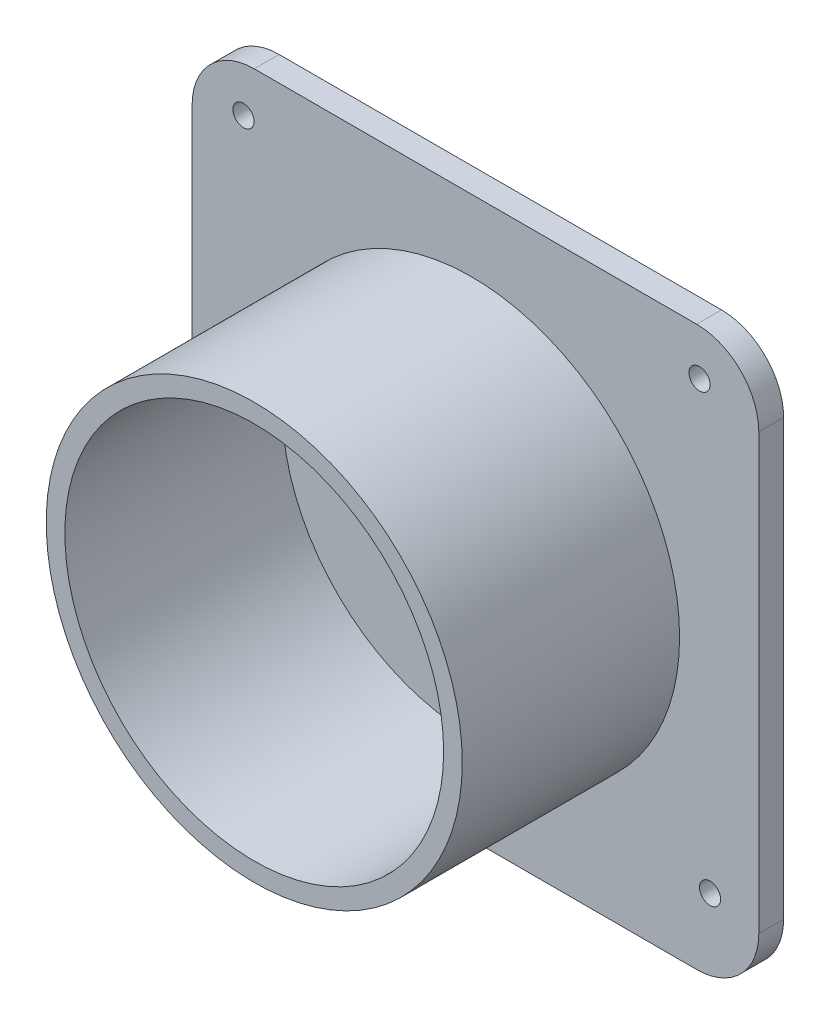
ISO-10303-21;
HEADER;
FILE_DESCRIPTION(('STEP AP214'),'2;1');
FILE_NAME('part.step','',(''),(''),'','','');
FILE_SCHEMA(('AUTOMOTIVE_DESIGN { 1 0 10303 214 1 1 1 1 }'));
ENDSEC;
DATA;
#1=APPLICATION_CONTEXT('core data for automotive mechanical design processes');
#2=APPLICATION_PROTOCOL_DEFINITION('international standard','automotive_design',2000,#1);
#3=PRODUCT_CONTEXT('',#1,'mechanical');
#4=PRODUCT('Part','Part','',(#3));
#5=PRODUCT_RELATED_PRODUCT_CATEGORY('part','',(#4));
#6=PRODUCT_DEFINITION_FORMATION('','',#4);
#7=PRODUCT_DEFINITION_CONTEXT('part definition',#1,'design');
#8=PRODUCT_DEFINITION('design','',#6,#7);
#9=PRODUCT_DEFINITION_SHAPE('','',#8);
#10=(LENGTH_UNIT() NAMED_UNIT(*) SI_UNIT(.MILLI.,.METRE.));
#11=(NAMED_UNIT(*) PLANE_ANGLE_UNIT() SI_UNIT($,.RADIAN.));
#12=(NAMED_UNIT(*) SI_UNIT($,.STERADIAN.) SOLID_ANGLE_UNIT());
#13=UNCERTAINTY_MEASURE_WITH_UNIT(LENGTH_MEASURE(1.E-05),#10,'distance_accuracy_value','');
#14=(GEOMETRIC_REPRESENTATION_CONTEXT(3) GLOBAL_UNCERTAINTY_ASSIGNED_CONTEXT((#13)) GLOBAL_UNIT_ASSIGNED_CONTEXT((#10,
#11,#12)) REPRESENTATION_CONTEXT('',''));
#15=CARTESIAN_POINT('',(0.,0.,0.));
#16=DIRECTION('',(0.,0.,1.));
#17=DIRECTION('',(1.,0.,0.));
#18=AXIS2_PLACEMENT_3D('',#15,#16,#17);
#19=CARTESIAN_POINT('',(-85.0491177864963,50.5839416058394,-5.));
#20=DIRECTION('',(-1.,0.,0.));
#21=DIRECTION('',(0.,-1.,0.));
#22=AXIS2_PLACEMENT_3D('',#19,#20,#21);
#23=PLANE('',#22);
#24=DIRECTION('',(0.,1.,0.));
#25=VECTOR('',#24,1.);
#26=CARTESIAN_POINT('',(-85.0491177864963,50.5839416058394,-4.00000000000001));
#27=LINE('',#26,#25);
#28=CARTESIAN_POINT('',(-85.0491177864963,-29.4160583941605,-4.00000000000001));
#29=VERTEX_POINT('',#28);
#30=CARTESIAN_POINT('',(-85.0491177864963,40.5839416058394,-4.00000000000001));
#31=VERTEX_POINT('',#30);
#32=EDGE_CURVE('E112',#29,#31,#27,.T.);
#33=ORIENTED_EDGE('',*,*,#32,.F.);
#34=DIRECTION('',(0.,0.,1.));
#35=VECTOR('',#34,1.);
#36=CARTESIAN_POINT('',(-85.0491177864963,-29.4160583941606,-5.));
#37=LINE('',#36,#35);
#38=CARTESIAN_POINT('',(-85.0491177864963,-29.4160583941605,0.));
#39=VERTEX_POINT('',#38);
#40=EDGE_CURVE('E125',#29,#39,#37,.T.);
#41=ORIENTED_EDGE('',*,*,#40,.T.);
#42=DIRECTION('',(0.,-1.,0.));
#43=VECTOR('',#42,1.);
#44=CARTESIAN_POINT('',(-85.0491177864963,50.5839416058394,0.));
#45=LINE('',#44,#43);
#46=CARTESIAN_POINT('',(-85.0491177864963,40.5839416058394,0.));
#47=VERTEX_POINT('',#46);
#48=EDGE_CURVE('E190',#47,#39,#45,.T.);
#49=ORIENTED_EDGE('',*,*,#48,.F.);
#50=DIRECTION('',(0.,0.,1.));
#51=VECTOR('',#50,1.);
#52=CARTESIAN_POINT('',(-85.0491177864963,40.5839416058394,-4.00000000000001));
#53=LINE('',#52,#51);
#54=EDGE_CURVE('E128',#47,#31,#53,.F.);
#55=ORIENTED_EDGE('',*,*,#54,.T.);
#56=EDGE_LOOP('',(#33,#41,#49,#55));
#57=FACE_BOUND('',#56,.T.);
#58=ADVANCED_FACE('F43',(#57),#23,.T.);
#59=CARTESIAN_POINT('',(-85.0491177864963,50.5839416058394,-5.));
#60=DIRECTION('',(0.,-1.,0.));
#61=DIRECTION('',(0.,0.,-1.));
#62=AXIS2_PLACEMENT_3D('',#59,#60,#61);
#63=PLANE('',#62);
#64=DIRECTION('',(1.,0.,0.));
#65=VECTOR('',#64,1.);
#66=CARTESIAN_POINT('',(-85.0491177864963,50.5839416058394,0.));
#67=LINE('',#66,#65);
#68=CARTESIAN_POINT('',(-75.0491177864963,50.5839416058394,0.));
#69=VERTEX_POINT('',#68);
#70=CARTESIAN_POINT('',(-3.79544039840603,50.5839416058394,0.));
#71=VERTEX_POINT('',#70);
#72=EDGE_CURVE('E176',#69,#71,#67,.T.);
#73=ORIENTED_EDGE('',*,*,#72,.T.);
#74=DIRECTION('',(0.,0.,1.));
#75=VECTOR('',#74,1.);
#76=CARTESIAN_POINT('',(-3.79544039840603,50.5839416058394,-5.));
#77=LINE('',#76,#75);
#78=CARTESIAN_POINT('',(-3.79544039840603,50.5839416058394,-4.00000000000001));
#79=VERTEX_POINT('',#78);
#80=EDGE_CURVE('E11',#71,#79,#77,.F.);
#81=ORIENTED_EDGE('',*,*,#80,.T.);
#82=DIRECTION('',(1.,0.,0.));
#83=VECTOR('',#82,1.);
#84=CARTESIAN_POINT('',(6.20455960159397,50.5839416058394,-4.00000000000001));
#85=LINE('',#84,#83);
#86=CARTESIAN_POINT('',(-75.0491177864963,50.5839416058394,-4.00000000000001));
#87=VERTEX_POINT('',#86);
#88=EDGE_CURVE('E130',#87,#79,#85,.T.);
#89=ORIENTED_EDGE('',*,*,#88,.F.);
#90=DIRECTION('',(0.,0.,1.));
#91=VECTOR('',#90,1.);
#92=CARTESIAN_POINT('',(-75.0491177864963,50.5839416058394,0.));
#93=LINE('',#92,#91);
#94=EDGE_CURVE('E52',#87,#69,#93,.T.);
#95=ORIENTED_EDGE('',*,*,#94,.T.);
#96=EDGE_LOOP('',(#73,#81,#89,#95));
#97=FACE_BOUND('',#96,.T.);
#98=ADVANCED_FACE('F175',(#97),#63,.F.);
#99=CARTESIAN_POINT('',(-85.0491177864963,-39.4160583941606,-5.));
#100=DIRECTION('',(0.,-1.,0.));
#101=DIRECTION('',(1.,0.,0.));
#102=AXIS2_PLACEMENT_3D('',#99,#100,#101);
#103=PLANE('',#102);
#104=DIRECTION('',(1.,0.,0.));
#105=VECTOR('',#104,1.);
#106=CARTESIAN_POINT('',(-85.0491177864963,-39.4160583941606,0.));
#107=LINE('',#106,#105);
#108=CARTESIAN_POINT('',(-75.0491177864963,-39.4160583941606,0.));
#109=VERTEX_POINT('',#108);
#110=CARTESIAN_POINT('',(-3.79544039840603,-39.4160583941606,0.));
#111=VERTEX_POINT('',#110);
#112=EDGE_CURVE('E183',#109,#111,#107,.T.);
#113=ORIENTED_EDGE('',*,*,#112,.F.);
#114=DIRECTION('',(0.,0.,1.));
#115=VECTOR('',#114,1.);
#116=CARTESIAN_POINT('',(-75.0491177864963,-39.4160583941606,-5.));
#117=LINE('',#116,#115);
#118=CARTESIAN_POINT('',(-75.0491177864963,-39.4160583941606,-4.00000000000001));
#119=VERTEX_POINT('',#118);
#120=EDGE_CURVE('E156',#109,#119,#117,.F.);
#121=ORIENTED_EDGE('',*,*,#120,.T.);
#122=DIRECTION('',(-1.,0.,0.));
#123=VECTOR('',#122,1.);
#124=CARTESIAN_POINT('',(6.20455960159397,-39.4160583941606,-4.00000000000001));
#125=LINE('',#124,#123);
#126=CARTESIAN_POINT('',(-3.79544039840603,-39.4160583941606,-4.00000000000001));
#127=VERTEX_POINT('',#126);
#128=EDGE_CURVE('E114',#127,#119,#125,.T.);
#129=ORIENTED_EDGE('',*,*,#128,.F.);
#130=DIRECTION('',(0.,0.,1.));
#131=VECTOR('',#130,1.);
#132=CARTESIAN_POINT('',(-3.79544039840603,-39.4160583941606,0.));
#133=LINE('',#132,#131);
#134=EDGE_CURVE('E152',#127,#111,#133,.T.);
#135=ORIENTED_EDGE('',*,*,#134,.T.);
#136=EDGE_LOOP('',(#113,#121,#129,#135));
#137=FACE_BOUND('',#136,.T.);
#138=ADVANCED_FACE('F259',(#137),#103,.T.);
#139=CARTESIAN_POINT('',(6.20455960159397,50.5839416058394,-9.99999999999999));
#140=DIRECTION('',(-1.,0.,0.));
#141=DIRECTION('',(0.,0.,1.));
#142=AXIS2_PLACEMENT_3D('',#139,#140,#141);
#143=PLANE('',#142);
#144=DIRECTION('',(0.,-1.,0.));
#145=VECTOR('',#144,1.);
#146=CARTESIAN_POINT('',(6.20455960159397,50.5839416058394,0.));
#147=LINE('',#146,#145);
#148=CARTESIAN_POINT('',(6.20455960159397,40.5839416058394,0.));
#149=VERTEX_POINT('',#148);
#150=CARTESIAN_POINT('',(6.20455960159397,-29.4160583941605,0.));
#151=VERTEX_POINT('',#150);
#152=EDGE_CURVE('E230',#149,#151,#147,.T.);
#153=ORIENTED_EDGE('',*,*,#152,.T.);
#154=DIRECTION('',(0.,0.,1.));
#155=VECTOR('',#154,1.);
#156=CARTESIAN_POINT('',(6.20455960159397,-29.4160583941606,-4.00000000000001));
#157=LINE('',#156,#155);
#158=CARTESIAN_POINT('',(6.20455960159397,-29.4160583941605,-4.00000000000001));
#159=VERTEX_POINT('',#158);
#160=EDGE_CURVE('E169',#151,#159,#157,.F.);
#161=ORIENTED_EDGE('',*,*,#160,.T.);
#162=DIRECTION('',(0.,-1.,0.));
#163=VECTOR('',#162,1.);
#164=CARTESIAN_POINT('',(6.20455960159397,50.5839416058394,-4.00000000000001));
#165=LINE('',#164,#163);
#166=CARTESIAN_POINT('',(6.20455960159397,40.5839416058394,-4.00000000000001));
#167=VERTEX_POINT('',#166);
#168=EDGE_CURVE('E274',#167,#159,#165,.T.);
#169=ORIENTED_EDGE('',*,*,#168,.F.);
#170=DIRECTION('',(0.,0.,1.));
#171=VECTOR('',#170,1.);
#172=CARTESIAN_POINT('',(6.20455960159397,40.5839416058394,-9.99999999999999));
#173=LINE('',#172,#171);
#174=EDGE_CURVE('E119',#167,#149,#173,.T.);
#175=ORIENTED_EDGE('',*,*,#174,.T.);
#176=EDGE_LOOP('',(#153,#161,#169,#175));
#177=FACE_BOUND('',#176,.T.);
#178=ADVANCED_FACE('F280',(#177),#143,.F.);
#179=CARTESIAN_POINT('',(-76.7779934385676,43.2074388504942,-9.99999999999999));
#180=DIRECTION('',(0.,0.,1.));
#181=DIRECTION('',(1.,0.,0.));
#182=AXIS2_PLACEMENT_3D('',#179,#180,#181);
#183=CYLINDRICAL_SURFACE('',#182,1.7);
#184=CARTESIAN_POINT('',(-76.7779934385676,43.2074388504942,0.));
#185=DIRECTION('',(0.,0.,1.));
#186=DIRECTION('',(1.,0.,0.));
#187=AXIS2_PLACEMENT_3D('',#184,#185,#186);
#188=CIRCLE('',#187,1.7);
#189=CARTESIAN_POINT('',(-75.0779934385676,43.2074388504942,0.));
#190=VERTEX_POINT('',#189);
#191=EDGE_CURVE('E223',#190,#190,#188,.T.);
#192=ORIENTED_EDGE('',*,*,#191,.T.);
#193=EDGE_LOOP('',(#192));
#194=FACE_BOUND('',#193,.T.);
#195=CARTESIAN_POINT('',(-76.7779934385676,43.2074388504942,-4.00000000000001));
#196=DIRECTION('',(0.,0.,-1.));
#197=DIRECTION('',(-1.,0.,0.));
#198=AXIS2_PLACEMENT_3D('',#195,#196,#197);
#199=CIRCLE('',#198,1.7);
#200=CARTESIAN_POINT('',(-78.4779934385676,43.2074388504942,-4.00000000000001));
#201=VERTEX_POINT('',#200);
#202=EDGE_CURVE('E210',#201,#201,#199,.F.);
#203=ORIENTED_EDGE('',*,*,#202,.F.);
#204=EDGE_LOOP('',(#203));
#205=FACE_BOUND('',#204,.T.);
#206=ADVANCED_FACE('F283',(#194,#205),#183,.F.);
#207=CARTESIAN_POINT('',(-76.7779934385676,-29.399888528193,-9.99999999999999));
#208=DIRECTION('',(0.,0.,1.));
#209=DIRECTION('',(1.,0.,0.));
#210=AXIS2_PLACEMENT_3D('',#207,#208,#209);
#211=CYLINDRICAL_SURFACE('',#210,1.7);
#212=CARTESIAN_POINT('',(-76.7779934385676,-29.399888528193,0.));
#213=DIRECTION('',(0.,0.,1.));
#214=DIRECTION('',(1.,0.,0.));
#215=AXIS2_PLACEMENT_3D('',#212,#213,#214);
#216=CIRCLE('',#215,1.7);
#217=CARTESIAN_POINT('',(-75.0779934385676,-29.399888528193,0.));
#218=VERTEX_POINT('',#217);
#219=EDGE_CURVE('E218',#218,#218,#216,.T.);
#220=ORIENTED_EDGE('',*,*,#219,.T.);
#221=EDGE_LOOP('',(#220));
#222=FACE_BOUND('',#221,.T.);
#223=CARTESIAN_POINT('',(-76.7779934385676,-29.399888528193,-4.00000000000001));
#224=DIRECTION('',(0.,0.,-1.));
#225=DIRECTION('',(-1.,0.,0.));
#226=AXIS2_PLACEMENT_3D('',#223,#224,#225);
#227=CIRCLE('',#226,1.7);
#228=CARTESIAN_POINT('',(-78.4779934385676,-29.399888528193,-4.00000000000001));
#229=VERTEX_POINT('',#228);
#230=EDGE_CURVE('E201',#229,#229,#227,.F.);
#231=ORIENTED_EDGE('',*,*,#230,.F.);
#232=EDGE_LOOP('',(#231));
#233=FACE_BOUND('',#232,.T.);
#234=ADVANCED_FACE('F289',(#222,#233),#211,.F.);
#235=CARTESIAN_POINT('',(-1.6406127147082,-27.699888528193,-9.99999999999999));
#236=DIRECTION('',(0.,0.,1.));
#237=DIRECTION('',(1.,0.,0.));
#238=AXIS2_PLACEMENT_3D('',#235,#236,#237);
#239=CYLINDRICAL_SURFACE('',#238,1.7);
#240=CARTESIAN_POINT('',(-1.6406127147082,-27.699888528193,0.));
#241=DIRECTION('',(0.,0.,1.));
#242=DIRECTION('',(1.,0.,0.));
#243=AXIS2_PLACEMENT_3D('',#240,#241,#242);
#244=CIRCLE('',#243,1.7);
#245=CARTESIAN_POINT('',(0.0593872852917977,-27.699888528193,0.));
#246=VERTEX_POINT('',#245);
#247=EDGE_CURVE('E214',#246,#246,#244,.T.);
#248=ORIENTED_EDGE('',*,*,#247,.T.);
#249=EDGE_LOOP('',(#248));
#250=FACE_BOUND('',#249,.T.);
#251=CARTESIAN_POINT('',(-1.6406127147082,-27.699888528193,-4.00000000000001));
#252=DIRECTION('',(0.,0.,-1.));
#253=DIRECTION('',(-1.,0.,0.));
#254=AXIS2_PLACEMENT_3D('',#251,#252,#253);
#255=CIRCLE('',#254,1.7);
#256=CARTESIAN_POINT('',(-3.3406127147082,-27.699888528193,-4.00000000000001));
#257=VERTEX_POINT('',#256);
#258=EDGE_CURVE('E196',#257,#257,#255,.F.);
#259=ORIENTED_EDGE('',*,*,#258,.F.);
#260=EDGE_LOOP('',(#259));
#261=FACE_BOUND('',#260,.T.);
#262=ADVANCED_FACE('F313',(#250,#261),#239,.F.);
#263=CARTESIAN_POINT('',(-3.3406127147082,43.2074388504942,-9.99999999999999));
#264=DIRECTION('',(0.,0.,1.));
#265=DIRECTION('',(1.,0.,0.));
#266=AXIS2_PLACEMENT_3D('',#263,#264,#265);
#267=CYLINDRICAL_SURFACE('',#266,1.7);
#268=CARTESIAN_POINT('',(-3.3406127147082,43.2074388504942,0.));
#269=DIRECTION('',(0.,0.,1.));
#270=DIRECTION('',(1.,0.,0.));
#271=AXIS2_PLACEMENT_3D('',#268,#269,#270);
#272=CIRCLE('',#271,1.7);
#273=CARTESIAN_POINT('',(-1.6406127147082,43.2074388504942,0.));
#274=VERTEX_POINT('',#273);
#275=EDGE_CURVE('E219',#274,#274,#272,.T.);
#276=ORIENTED_EDGE('',*,*,#275,.T.);
#277=EDGE_LOOP('',(#276));
#278=FACE_BOUND('',#277,.T.);
#279=CARTESIAN_POINT('',(-3.3406127147082,43.2074388504942,-4.00000000000001));
#280=DIRECTION('',(0.,0.,-1.));
#281=DIRECTION('',(-1.,0.,0.));
#282=AXIS2_PLACEMENT_3D('',#279,#280,#281);
#283=CIRCLE('',#282,1.7);
#284=CARTESIAN_POINT('',(-5.0406127147082,43.2074388504942,-4.00000000000001));
#285=VERTEX_POINT('',#284);
#286=EDGE_CURVE('E193',#285,#285,#283,.F.);
#287=ORIENTED_EDGE('',*,*,#286,.F.);
#288=EDGE_LOOP('',(#287));
#289=FACE_BOUND('',#288,.T.);
#290=ADVANCED_FACE('F308',(#278,#289),#267,.F.);
#291=CARTESIAN_POINT('',(0.,0.,0.));
#292=DIRECTION('',(0.,0.,1.));
#293=DIRECTION('',(1.,0.,0.));
#294=AXIS2_PLACEMENT_3D('',#291,#292,#293);
#295=PLANE('',#294);
#296=ORIENTED_EDGE('',*,*,#275,.F.);
#297=EDGE_LOOP('',(#296));
#298=FACE_BOUND('',#297,.T.);
#299=ORIENTED_EDGE('',*,*,#219,.F.);
#300=EDGE_LOOP('',(#299));
#301=FACE_BOUND('',#300,.T.);
#302=ORIENTED_EDGE('',*,*,#247,.F.);
#303=EDGE_LOOP('',(#302));
#304=FACE_BOUND('',#303,.T.);
#305=ORIENTED_EDGE('',*,*,#191,.F.);
#306=EDGE_LOOP('',(#305));
#307=FACE_BOUND('',#306,.T.);
#308=ORIENTED_EDGE('',*,*,#48,.T.);
#309=CARTESIAN_POINT('',(-75.0491177864963,-29.4160583941606,0.));
#310=DIRECTION('',(0.,0.,1.));
#311=DIRECTION('',(1.,0.,0.));
#312=AXIS2_PLACEMENT_3D('',#309,#310,#311);
#313=CIRCLE('',#312,10.);
#314=EDGE_CURVE('E133',#39,#109,#313,.T.);
#315=ORIENTED_EDGE('',*,*,#314,.T.);
#316=ORIENTED_EDGE('',*,*,#112,.T.);
#317=CARTESIAN_POINT('',(-3.79544039840603,-29.4160583941606,0.));
#318=DIRECTION('',(0.,0.,1.));
#319=DIRECTION('',(1.,0.,0.));
#320=AXIS2_PLACEMENT_3D('',#317,#318,#319);
#321=CIRCLE('',#320,10.);
#322=EDGE_CURVE('E147',#111,#151,#321,.T.);
#323=ORIENTED_EDGE('',*,*,#322,.T.);
#324=ORIENTED_EDGE('',*,*,#152,.F.);
#325=CARTESIAN_POINT('',(-3.79544039840603,40.5839416058394,0.));
#326=DIRECTION('',(0.,0.,1.));
#327=DIRECTION('',(1.,0.,0.));
#328=AXIS2_PLACEMENT_3D('',#325,#326,#327);
#329=CIRCLE('',#328,10.);
#330=EDGE_CURVE('E139',#149,#71,#329,.T.);
#331=ORIENTED_EDGE('',*,*,#330,.T.);
#332=ORIENTED_EDGE('',*,*,#72,.F.);
#333=CARTESIAN_POINT('',(-75.0491177864963,40.5839416058394,0.));
#334=DIRECTION('',(0.,0.,1.));
#335=DIRECTION('',(1.,0.,0.));
#336=AXIS2_PLACEMENT_3D('',#333,#334,#335);
#337=CIRCLE('',#336,10.);
#338=EDGE_CURVE('E135',#69,#47,#337,.T.);
#339=ORIENTED_EDGE('',*,*,#338,.T.);
#340=EDGE_LOOP('',(#308,#315,#316,#323,#324,#331,#332,#339));
#341=FACE_BOUND('',#340,.T.);
#342=CARTESIAN_POINT('',(-40.0491177864963,5.58394160583942,0.));
#343=DIRECTION('',(0.,0.,1.));
#344=DIRECTION('',(1.,0.,0.));
#345=AXIS2_PLACEMENT_3D('',#342,#343,#344);
#346=CIRCLE('',#345,33.5);
#347=CARTESIAN_POINT('',(-6.54911778649633,5.58394160583942,0.));
#348=VERTEX_POINT('',#347);
#349=EDGE_CURVE('E234',#348,#348,#346,.T.);
#350=ORIENTED_EDGE('',*,*,#349,.F.);
#351=EDGE_LOOP('',(#350));
#352=FACE_BOUND('',#351,.T.);
#353=ADVANCED_FACE('F179',(#298,#301,#304,#307,#341,#352),#295,.T.);
#354=CARTESIAN_POINT('',(-40.0491177864963,5.58394160583942,35.));
#355=DIRECTION('',(0.,0.,-1.));
#356=DIRECTION('',(-1.,0.,0.));
#357=AXIS2_PLACEMENT_3D('',#354,#355,#356);
#358=CYLINDRICAL_SURFACE('',#357,30.5);
#359=CARTESIAN_POINT('',(-40.0491177864963,5.58394160583942,35.));
#360=DIRECTION('',(0.,0.,1.));
#361=DIRECTION('',(1.,0.,0.));
#362=AXIS2_PLACEMENT_3D('',#359,#360,#361);
#363=CIRCLE('',#362,30.5);
#364=CARTESIAN_POINT('',(-9.54911778649634,5.58394160583942,35.));
#365=VERTEX_POINT('',#364);
#366=EDGE_CURVE('E235',#365,#365,#363,.T.);
#367=ORIENTED_EDGE('',*,*,#366,.T.);
#368=EDGE_LOOP('',(#367));
#369=FACE_BOUND('',#368,.T.);
#370=CARTESIAN_POINT('',(-40.0491177864963,5.58394160583942,0.));
#371=DIRECTION('',(0.,0.,1.));
#372=DIRECTION('',(1.,0.,0.));
#373=AXIS2_PLACEMENT_3D('',#370,#371,#372);
#374=CIRCLE('',#373,30.5);
#375=CARTESIAN_POINT('',(-9.54911778649634,5.58394160583942,0.));
#376=VERTEX_POINT('',#375);
#377=EDGE_CURVE('E141',#376,#376,#374,.F.);
#378=ORIENTED_EDGE('',*,*,#377,.T.);
#379=EDGE_LOOP('',(#378));
#380=FACE_BOUND('',#379,.T.);
#381=ADVANCED_FACE('F302',(#369,#380),#358,.F.);
#382=CARTESIAN_POINT('',(-40.0491177864963,5.58394160583942,35.));
#383=DIRECTION('',(0.,0.,-1.));
#384=DIRECTION('',(-1.,0.,0.));
#385=AXIS2_PLACEMENT_3D('',#382,#383,#384);
#386=CYLINDRICAL_SURFACE('',#385,33.5);
#387=CARTESIAN_POINT('',(-40.0491177864963,5.58394160583942,35.));
#388=DIRECTION('',(0.,0.,1.));
#389=DIRECTION('',(1.,0.,0.));
#390=AXIS2_PLACEMENT_3D('',#387,#388,#389);
#391=CIRCLE('',#390,33.5);
#392=CARTESIAN_POINT('',(-6.54911778649633,5.58394160583942,35.));
#393=VERTEX_POINT('',#392);
#394=EDGE_CURVE('E239',#393,#393,#391,.T.);
#395=ORIENTED_EDGE('',*,*,#394,.F.);
#396=EDGE_LOOP('',(#395));
#397=FACE_BOUND('',#396,.T.);
#398=ORIENTED_EDGE('',*,*,#349,.T.);
#399=EDGE_LOOP('',(#398));
#400=FACE_BOUND('',#399,.T.);
#401=ADVANCED_FACE('F298',(#397,#400),#386,.T.);
#402=CARTESIAN_POINT('',(0.,0.,35.));
#403=DIRECTION('',(0.,0.,1.));
#404=DIRECTION('',(1.,0.,0.));
#405=AXIS2_PLACEMENT_3D('',#402,#403,#404);
#406=PLANE('',#405);
#407=ORIENTED_EDGE('',*,*,#366,.F.);
#408=EDGE_LOOP('',(#407));
#409=FACE_BOUND('',#408,.T.);
#410=ORIENTED_EDGE('',*,*,#394,.T.);
#411=EDGE_LOOP('',(#410));
#412=FACE_BOUND('',#411,.T.);
#413=ADVANCED_FACE('F294',(#409,#412),#406,.T.);
#414=ORIENTED_EDGE('',*,*,#377,.F.);
#415=EDGE_LOOP('',(#414));
#416=FACE_BOUND('',#415,.T.);
#417=ADVANCED_FACE('F297',(#416),#295,.T.);
#418=CARTESIAN_POINT('',(0.,0.,-4.00000000000001));
#419=DIRECTION('',(0.,0.,-1.));
#420=DIRECTION('',(-1.,0.,0.));
#421=AXIS2_PLACEMENT_3D('',#418,#419,#420);
#422=PLANE('',#421);
#423=ORIENTED_EDGE('',*,*,#128,.T.);
#424=CARTESIAN_POINT('',(-75.0491177864963,-29.4160583941606,-4.00000000000001));
#425=DIRECTION('',(0.,0.,-1.));
#426=DIRECTION('',(-1.,0.,0.));
#427=AXIS2_PLACEMENT_3D('',#424,#425,#426);
#428=CIRCLE('',#427,10.);
#429=EDGE_CURVE('E108',#119,#29,#428,.T.);
#430=ORIENTED_EDGE('',*,*,#429,.T.);
#431=ORIENTED_EDGE('',*,*,#32,.T.);
#432=CARTESIAN_POINT('',(-75.0491177864963,40.5839416058394,-4.00000000000001));
#433=DIRECTION('',(0.,0.,-1.));
#434=DIRECTION('',(-1.,0.,0.));
#435=AXIS2_PLACEMENT_3D('',#432,#433,#434);
#436=CIRCLE('',#435,10.);
#437=EDGE_CURVE('E64',#31,#87,#436,.T.);
#438=ORIENTED_EDGE('',*,*,#437,.T.);
#439=ORIENTED_EDGE('',*,*,#88,.T.);
#440=CARTESIAN_POINT('',(-3.79544039840603,40.5839416058394,-4.00000000000001));
#441=DIRECTION('',(0.,0.,-1.));
#442=DIRECTION('',(-1.,0.,0.));
#443=AXIS2_PLACEMENT_3D('',#440,#441,#442);
#444=CIRCLE('',#443,10.);
#445=EDGE_CURVE('E161',#79,#167,#444,.T.);
#446=ORIENTED_EDGE('',*,*,#445,.T.);
#447=ORIENTED_EDGE('',*,*,#168,.T.);
#448=CARTESIAN_POINT('',(-3.79544039840603,-29.4160583941606,-4.00000000000001));
#449=DIRECTION('',(0.,0.,-1.));
#450=DIRECTION('',(-1.,0.,0.));
#451=AXIS2_PLACEMENT_3D('',#448,#449,#450);
#452=CIRCLE('',#451,10.);
#453=EDGE_CURVE('E120',#159,#127,#452,.T.);
#454=ORIENTED_EDGE('',*,*,#453,.T.);
#455=EDGE_LOOP('',(#423,#430,#431,#438,#439,#446,#447,#454));
#456=FACE_BOUND('',#455,.T.);
#457=ORIENTED_EDGE('',*,*,#286,.T.);
#458=EDGE_LOOP('',(#457));
#459=FACE_BOUND('',#458,.T.);
#460=ORIENTED_EDGE('',*,*,#258,.T.);
#461=EDGE_LOOP('',(#460));
#462=FACE_BOUND('',#461,.T.);
#463=ORIENTED_EDGE('',*,*,#230,.T.);
#464=EDGE_LOOP('',(#463));
#465=FACE_BOUND('',#464,.T.);
#466=ORIENTED_EDGE('',*,*,#202,.T.);
#467=EDGE_LOOP('',(#466));
#468=FACE_BOUND('',#467,.T.);
#469=ADVANCED_FACE('F110',(#456,#459,#462,#465,#468),#422,.T.);
#470=CARTESIAN_POINT('',(-75.0491177864963,-29.4160583941606,-5.));
#471=DIRECTION('',(0.,0.,1.));
#472=DIRECTION('',(1.,0.,0.));
#473=AXIS2_PLACEMENT_3D('',#470,#471,#472);
#474=CYLINDRICAL_SURFACE('',#473,10.);
#475=ORIENTED_EDGE('',*,*,#429,.F.);
#476=ORIENTED_EDGE('',*,*,#120,.F.);
#477=ORIENTED_EDGE('',*,*,#314,.F.);
#478=ORIENTED_EDGE('',*,*,#40,.F.);
#479=EDGE_LOOP('',(#475,#476,#477,#478));
#480=FACE_BOUND('',#479,.T.);
#481=ADVANCED_FACE('F132',(#480),#474,.T.);
#482=CARTESIAN_POINT('',(-3.79544039840603,-29.4160583941606,-5.));
#483=DIRECTION('',(0.,0.,-1.));
#484=DIRECTION('',(-1.,0.,0.));
#485=AXIS2_PLACEMENT_3D('',#482,#483,#484);
#486=CYLINDRICAL_SURFACE('',#485,10.);
#487=ORIENTED_EDGE('',*,*,#453,.F.);
#488=ORIENTED_EDGE('',*,*,#160,.F.);
#489=ORIENTED_EDGE('',*,*,#322,.F.);
#490=ORIENTED_EDGE('',*,*,#134,.F.);
#491=EDGE_LOOP('',(#487,#488,#489,#490));
#492=FACE_BOUND('',#491,.T.);
#493=ADVANCED_FACE('F252',(#492),#486,.T.);
#494=CARTESIAN_POINT('',(-3.79544039840603,40.5839416058394,-9.99999999999999));
#495=DIRECTION('',(0.,0.,1.));
#496=DIRECTION('',(1.,0.,0.));
#497=AXIS2_PLACEMENT_3D('',#494,#495,#496);
#498=CYLINDRICAL_SURFACE('',#497,10.);
#499=ORIENTED_EDGE('',*,*,#445,.F.);
#500=ORIENTED_EDGE('',*,*,#80,.F.);
#501=ORIENTED_EDGE('',*,*,#330,.F.);
#502=ORIENTED_EDGE('',*,*,#174,.F.);
#503=EDGE_LOOP('',(#499,#500,#501,#502));
#504=FACE_BOUND('',#503,.T.);
#505=ADVANCED_FACE('F248',(#504),#498,.T.);
#506=CARTESIAN_POINT('',(-75.0491177864963,40.5839416058394,-5.));
#507=DIRECTION('',(0.,0.,-1.));
#508=DIRECTION('',(-1.,0.,0.));
#509=AXIS2_PLACEMENT_3D('',#506,#507,#508);
#510=CYLINDRICAL_SURFACE('',#509,10.);
#511=ORIENTED_EDGE('',*,*,#437,.F.);
#512=ORIENTED_EDGE('',*,*,#54,.F.);
#513=ORIENTED_EDGE('',*,*,#338,.F.);
#514=ORIENTED_EDGE('',*,*,#94,.F.);
#515=EDGE_LOOP('',(#511,#512,#513,#514));
#516=FACE_BOUND('',#515,.T.);
#517=ADVANCED_FACE('F45',(#516),#510,.T.);
#518=CLOSED_SHELL('',(#58,#98,#138,#178,#206,#234,#262,#290,#353,#381,#401,#413,#417,#469,#481,
#493,#505,#517));
#519=MANIFOLD_SOLID_BREP('B2',#518);
#520=ADVANCED_BREP_SHAPE_REPRESENTATION('',(#18,#519),#14);
#521=SHAPE_DEFINITION_REPRESENTATION(#9,#520);
ENDSEC;
END-ISO-10303-21;
